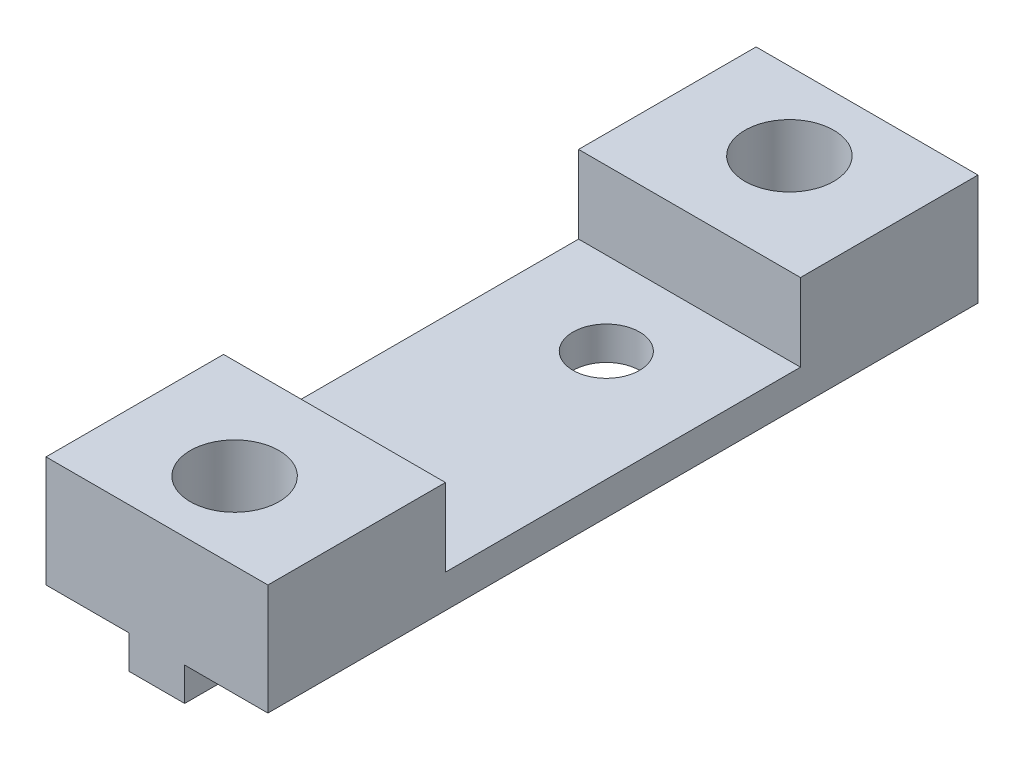
ISO-10303-21;
HEADER;
FILE_DESCRIPTION(('STEP AP214'),'2;1');
FILE_NAME('part.step','',(''),(''),'','','');
FILE_SCHEMA(('AUTOMOTIVE_DESIGN { 1 0 10303 214 1 1 1 1 }'));
ENDSEC;
DATA;
#1=APPLICATION_CONTEXT('core data for automotive mechanical design processes');
#2=APPLICATION_PROTOCOL_DEFINITION('international standard','automotive_design',2000,#1);
#3=PRODUCT_CONTEXT('',#1,'mechanical');
#4=PRODUCT('Part','Part','',(#3));
#5=PRODUCT_RELATED_PRODUCT_CATEGORY('part','',(#4));
#6=PRODUCT_DEFINITION_FORMATION('','',#4);
#7=PRODUCT_DEFINITION_CONTEXT('part definition',#1,'design');
#8=PRODUCT_DEFINITION('design','',#6,#7);
#9=PRODUCT_DEFINITION_SHAPE('','',#8);
#10=(LENGTH_UNIT() NAMED_UNIT(*) SI_UNIT(.MILLI.,.METRE.));
#11=(NAMED_UNIT(*) PLANE_ANGLE_UNIT() SI_UNIT($,.RADIAN.));
#12=(NAMED_UNIT(*) SI_UNIT($,.STERADIAN.) SOLID_ANGLE_UNIT());
#13=UNCERTAINTY_MEASURE_WITH_UNIT(LENGTH_MEASURE(1.E-05),#10,'distance_accuracy_value','');
#14=(GEOMETRIC_REPRESENTATION_CONTEXT(3) GLOBAL_UNCERTAINTY_ASSIGNED_CONTEXT((#13)) GLOBAL_UNIT_ASSIGNED_CONTEXT((#10,
#11,#12)) REPRESENTATION_CONTEXT('',''));
#15=CARTESIAN_POINT('',(0.,0.,0.));
#16=DIRECTION('',(0.,0.,1.));
#17=DIRECTION('',(1.,0.,0.));
#18=AXIS2_PLACEMENT_3D('',#15,#16,#17);
#19=CARTESIAN_POINT('',(0.,0.,0.));
#20=DIRECTION('',(0.,-1.,0.));
#21=DIRECTION('',(0.,0.,-1.));
#22=AXIS2_PLACEMENT_3D('',#19,#20,#21);
#23=PLANE('',#22);
#24=CARTESIAN_POINT('',(0.,0.,8.5));
#25=DIRECTION('',(0.,-1.,0.));
#26=DIRECTION('',(0.,0.,-1.));
#27=AXIS2_PLACEMENT_3D('',#24,#25,#26);
#28=CIRCLE('',#27,3.);
#29=CARTESIAN_POINT('',(0.,0.,5.5));
#30=VERTEX_POINT('',#29);
#31=EDGE_CURVE('E45',#30,#30,#28,.T.);
#32=ORIENTED_EDGE('',*,*,#31,.F.);
#33=EDGE_LOOP('',(#32));
#34=FACE_BOUND('',#33,.T.);
#35=DIRECTION('',(1.,0.,0.));
#36=VECTOR('',#35,1.);
#37=CARTESIAN_POINT('',(-2.5,0.,25.));
#38=LINE('',#37,#36);
#39=CARTESIAN_POINT('',(-2.5,0.,25.));
#40=VERTEX_POINT('',#39);
#41=CARTESIAN_POINT('',(2.5,0.,25.));
#42=VERTEX_POINT('',#41);
#43=EDGE_CURVE('E176',#40,#42,#38,.T.);
#44=ORIENTED_EDGE('',*,*,#43,.F.);
#45=DIRECTION('',(0.,0.,1.));
#46=VECTOR('',#45,1.);
#47=CARTESIAN_POINT('',(-2.5,0.,49.));
#48=LINE('',#47,#46);
#49=CARTESIAN_POINT('',(-2.5,0.,49.));
#50=VERTEX_POINT('',#49);
#51=EDGE_CURVE('E66',#40,#50,#48,.T.);
#52=ORIENTED_EDGE('',*,*,#51,.T.);
#53=DIRECTION('',(-1.,0.,0.));
#54=VECTOR('',#53,1.);
#55=CARTESIAN_POINT('',(-10.,0.,49.));
#56=LINE('',#55,#54);
#57=CARTESIAN_POINT('',(-10.,0.,49.));
#58=VERTEX_POINT('',#57);
#59=EDGE_CURVE('E233',#50,#58,#56,.T.);
#60=ORIENTED_EDGE('',*,*,#59,.T.);
#61=DIRECTION('',(0.,0.,1.));
#62=VECTOR('',#61,1.);
#63=CARTESIAN_POINT('',(-10.,0.,15.));
#64=LINE('',#63,#62);
#65=CARTESIAN_POINT('',(-10.,0.,-15.));
#66=VERTEX_POINT('',#65);
#67=EDGE_CURVE('E327',#66,#58,#64,.T.);
#68=ORIENTED_EDGE('',*,*,#67,.F.);
#69=DIRECTION('',(-1.,0.,0.));
#70=VECTOR('',#69,1.);
#71=CARTESIAN_POINT('',(-10.,0.,-15.));
#72=LINE('',#71,#70);
#73=CARTESIAN_POINT('',(-2.5,0.,-15.));
#74=VERTEX_POINT('',#73);
#75=EDGE_CURVE('E334',#74,#66,#72,.T.);
#76=ORIENTED_EDGE('',*,*,#75,.F.);
#77=DIRECTION('',(0.,0.,-1.));
#78=VECTOR('',#77,1.);
#79=CARTESIAN_POINT('',(-2.5,0.,-15.));
#80=LINE('',#79,#78);
#81=CARTESIAN_POINT('',(-2.5,0.,-3.));
#82=VERTEX_POINT('',#81);
#83=EDGE_CURVE('E287',#82,#74,#80,.T.);
#84=ORIENTED_EDGE('',*,*,#83,.F.);
#85=DIRECTION('',(-1.,0.,0.));
#86=VECTOR('',#85,1.);
#87=CARTESIAN_POINT('',(-2.5,0.,-3.));
#88=LINE('',#87,#86);
#89=CARTESIAN_POINT('',(2.5,0.,-3.));
#90=VERTEX_POINT('',#89);
#91=EDGE_CURVE('E300',#90,#82,#88,.T.);
#92=ORIENTED_EDGE('',*,*,#91,.F.);
#93=DIRECTION('',(0.,0.,1.));
#94=VECTOR('',#93,1.);
#95=CARTESIAN_POINT('',(2.5,0.,-15.));
#96=LINE('',#95,#94);
#97=CARTESIAN_POINT('',(2.5,0.,-15.));
#98=VERTEX_POINT('',#97);
#99=EDGE_CURVE('E281',#98,#90,#96,.T.);
#100=ORIENTED_EDGE('',*,*,#99,.F.);
#101=CARTESIAN_POINT('',(10.,0.,-15.));
#102=VERTEX_POINT('',#101);
#103=EDGE_CURVE('E335',#102,#98,#72,.T.);
#104=ORIENTED_EDGE('',*,*,#103,.F.);
#105=DIRECTION('',(0.,0.,-1.));
#106=VECTOR('',#105,1.);
#107=CARTESIAN_POINT('',(10.,0.,15.));
#108=LINE('',#107,#106);
#109=CARTESIAN_POINT('',(10.,0.,49.));
#110=VERTEX_POINT('',#109);
#111=EDGE_CURVE('E322',#110,#102,#108,.T.);
#112=ORIENTED_EDGE('',*,*,#111,.F.);
#113=CARTESIAN_POINT('',(2.5,0.,49.));
#114=VERTEX_POINT('',#113);
#115=EDGE_CURVE('E234',#110,#114,#56,.T.);
#116=ORIENTED_EDGE('',*,*,#115,.T.);
#117=DIRECTION('',(0.,0.,-1.));
#118=VECTOR('',#117,1.);
#119=CARTESIAN_POINT('',(2.5,0.,49.));
#120=LINE('',#119,#118);
#121=EDGE_CURVE('E58',#114,#42,#120,.T.);
#122=ORIENTED_EDGE('',*,*,#121,.T.);
#123=EDGE_LOOP('',(#44,#52,#60,#68,#76,#84,#92,#100,#104,#112,#116,#122));
#124=FACE_BOUND('',#123,.T.);
#125=ADVANCED_FACE('F41',(#34,#124),#23,.T.);
#126=CARTESIAN_POINT('',(0.,3.,0.));
#127=DIRECTION('',(0.,-1.,0.));
#128=DIRECTION('',(0.,0.,-1.));
#129=AXIS2_PLACEMENT_3D('',#126,#127,#128);
#130=PLANE('',#129);
#131=CARTESIAN_POINT('',(0.,3.,8.5));
#132=DIRECTION('',(0.,-1.,0.));
#133=DIRECTION('',(0.,0.,-1.));
#134=AXIS2_PLACEMENT_3D('',#131,#132,#133);
#135=CIRCLE('',#134,3.);
#136=CARTESIAN_POINT('',(0.,3.,5.5));
#137=VERTEX_POINT('',#136);
#138=EDGE_CURVE('E273',#137,#137,#135,.T.);
#139=ORIENTED_EDGE('',*,*,#138,.T.);
#140=EDGE_LOOP('',(#139));
#141=FACE_BOUND('',#140,.T.);
#142=DIRECTION('',(0.,0.,1.));
#143=VECTOR('',#142,1.);
#144=CARTESIAN_POINT('',(-10.,3.,15.));
#145=LINE('',#144,#143);
#146=CARTESIAN_POINT('',(-10.,3.,0.999999999999997));
#147=VERTEX_POINT('',#146);
#148=CARTESIAN_POINT('',(-10.,3.,33.));
#149=VERTEX_POINT('',#148);
#150=EDGE_CURVE('E326',#147,#149,#145,.T.);
#151=ORIENTED_EDGE('',*,*,#150,.T.);
#152=DIRECTION('',(1.,0.,0.));
#153=VECTOR('',#152,1.);
#154=CARTESIAN_POINT('',(0.,3.,33.));
#155=LINE('',#154,#153);
#156=CARTESIAN_POINT('',(10.,3.,33.));
#157=VERTEX_POINT('',#156);
#158=EDGE_CURVE('E198',#149,#157,#155,.T.);
#159=ORIENTED_EDGE('',*,*,#158,.T.);
#160=DIRECTION('',(0.,0.,-1.));
#161=VECTOR('',#160,1.);
#162=CARTESIAN_POINT('',(10.,3.,15.));
#163=LINE('',#162,#161);
#164=CARTESIAN_POINT('',(10.,3.,0.999999999999997));
#165=VERTEX_POINT('',#164);
#166=EDGE_CURVE('E323',#157,#165,#163,.T.);
#167=ORIENTED_EDGE('',*,*,#166,.T.);
#168=DIRECTION('',(1.,0.,0.));
#169=VECTOR('',#168,1.);
#170=CARTESIAN_POINT('',(0.,3.,0.999999999999997));
#171=LINE('',#170,#169);
#172=EDGE_CURVE('E246',#147,#165,#171,.T.);
#173=ORIENTED_EDGE('',*,*,#172,.F.);
#174=EDGE_LOOP('',(#151,#159,#167,#173));
#175=FACE_BOUND('',#174,.T.);
#176=ADVANCED_FACE('F380',(#141,#175),#130,.F.);
#177=CARTESIAN_POINT('',(10.,3.,15.));
#178=DIRECTION('',(-1.,0.,0.));
#179=DIRECTION('',(0.,0.,1.));
#180=AXIS2_PLACEMENT_3D('',#177,#178,#179);
#181=PLANE('',#180);
#182=DIRECTION('',(0.,-1.,0.));
#183=VECTOR('',#182,1.);
#184=CARTESIAN_POINT('',(10.,35.6124969497314,0.999999999999997));
#185=LINE('',#184,#183);
#186=CARTESIAN_POINT('',(10.,10.,0.999999999999997));
#187=VERTEX_POINT('',#186);
#188=EDGE_CURVE('E245',#187,#165,#185,.T.);
#189=ORIENTED_EDGE('',*,*,#188,.T.);
#190=ORIENTED_EDGE('',*,*,#166,.F.);
#191=DIRECTION('',(0.,-1.,0.));
#192=VECTOR('',#191,1.);
#193=CARTESIAN_POINT('',(10.,35.6124969497314,33.));
#194=LINE('',#193,#192);
#195=CARTESIAN_POINT('',(10.,10.,33.));
#196=VERTEX_POINT('',#195);
#197=EDGE_CURVE('E205',#196,#157,#194,.T.);
#198=ORIENTED_EDGE('',*,*,#197,.F.);
#199=DIRECTION('',(0.,0.,1.));
#200=VECTOR('',#199,1.);
#201=CARTESIAN_POINT('',(10.,10.,34.));
#202=LINE('',#201,#200);
#203=CARTESIAN_POINT('',(10.,10.,49.));
#204=VERTEX_POINT('',#203);
#205=EDGE_CURVE('E194',#196,#204,#202,.T.);
#206=ORIENTED_EDGE('',*,*,#205,.T.);
#207=DIRECTION('',(0.,-1.,0.));
#208=VECTOR('',#207,1.);
#209=CARTESIAN_POINT('',(10.,3.,49.));
#210=LINE('',#209,#208);
#211=EDGE_CURVE('E237',#204,#110,#210,.T.);
#212=ORIENTED_EDGE('',*,*,#211,.T.);
#213=ORIENTED_EDGE('',*,*,#111,.T.);
#214=DIRECTION('',(0.,-1.,0.));
#215=VECTOR('',#214,1.);
#216=CARTESIAN_POINT('',(10.,3.,-15.));
#217=LINE('',#216,#215);
#218=CARTESIAN_POINT('',(10.,10.,-15.));
#219=VERTEX_POINT('',#218);
#220=EDGE_CURVE('E51',#219,#102,#217,.T.);
#221=ORIENTED_EDGE('',*,*,#220,.F.);
#222=DIRECTION('',(0.,0.,-1.));
#223=VECTOR('',#222,1.);
#224=CARTESIAN_POINT('',(10.,10.,0.));
#225=LINE('',#224,#223);
#226=EDGE_CURVE('E260',#187,#219,#225,.T.);
#227=ORIENTED_EDGE('',*,*,#226,.F.);
#228=EDGE_LOOP('',(#189,#190,#198,#206,#212,#213,#221,#227));
#229=FACE_BOUND('',#228,.T.);
#230=ADVANCED_FACE('F43',(#229),#181,.F.);
#231=CARTESIAN_POINT('',(-10.,3.,-15.));
#232=DIRECTION('',(0.,0.,1.));
#233=DIRECTION('',(1.,0.,0.));
#234=AXIS2_PLACEMENT_3D('',#231,#232,#233);
#235=PLANE('',#234);
#236=ORIENTED_EDGE('',*,*,#103,.T.);
#237=DIRECTION('',(0.,1.,0.));
#238=VECTOR('',#237,1.);
#239=CARTESIAN_POINT('',(2.5,-3.,-15.));
#240=LINE('',#239,#238);
#241=CARTESIAN_POINT('',(2.5,-3.,-15.));
#242=VERTEX_POINT('',#241);
#243=EDGE_CURVE('E296',#242,#98,#240,.T.);
#244=ORIENTED_EDGE('',*,*,#243,.F.);
#245=DIRECTION('',(1.,0.,0.));
#246=VECTOR('',#245,1.);
#247=CARTESIAN_POINT('',(-2.5,-3.,-15.));
#248=LINE('',#247,#246);
#249=CARTESIAN_POINT('',(-2.5,-3.,-15.));
#250=VERTEX_POINT('',#249);
#251=EDGE_CURVE('E293',#250,#242,#248,.T.);
#252=ORIENTED_EDGE('',*,*,#251,.F.);
#253=DIRECTION('',(0.,1.,0.));
#254=VECTOR('',#253,1.);
#255=CARTESIAN_POINT('',(-2.5,-3.,-15.));
#256=LINE('',#255,#254);
#257=EDGE_CURVE('E310',#250,#74,#256,.T.);
#258=ORIENTED_EDGE('',*,*,#257,.T.);
#259=ORIENTED_EDGE('',*,*,#75,.T.);
#260=DIRECTION('',(0.,-1.,0.));
#261=VECTOR('',#260,1.);
#262=CARTESIAN_POINT('',(-10.,3.,-15.));
#263=LINE('',#262,#261);
#264=CARTESIAN_POINT('',(-10.,10.,-15.));
#265=VERTEX_POINT('',#264);
#266=EDGE_CURVE('E331',#265,#66,#263,.T.);
#267=ORIENTED_EDGE('',*,*,#266,.F.);
#268=DIRECTION('',(-1.,0.,0.));
#269=VECTOR('',#268,1.);
#270=CARTESIAN_POINT('',(0.,10.,-15.));
#271=LINE('',#270,#269);
#272=EDGE_CURVE('E256',#219,#265,#271,.T.);
#273=ORIENTED_EDGE('',*,*,#272,.F.);
#274=ORIENTED_EDGE('',*,*,#220,.T.);
#275=EDGE_LOOP('',(#236,#244,#252,#258,#259,#267,#273,#274));
#276=FACE_BOUND('',#275,.T.);
#277=ADVANCED_FACE('F349',(#276),#235,.F.);
#278=CARTESIAN_POINT('',(-10.,3.,15.));
#279=DIRECTION('',(1.,0.,0.));
#280=DIRECTION('',(0.,0.,-1.));
#281=AXIS2_PLACEMENT_3D('',#278,#279,#280);
#282=PLANE('',#281);
#283=ORIENTED_EDGE('',*,*,#67,.T.);
#284=DIRECTION('',(0.,-1.,0.));
#285=VECTOR('',#284,1.);
#286=CARTESIAN_POINT('',(-10.,3.,49.));
#287=LINE('',#286,#285);
#288=CARTESIAN_POINT('',(-10.,10.,49.));
#289=VERTEX_POINT('',#288);
#290=EDGE_CURVE('E241',#289,#58,#287,.T.);
#291=ORIENTED_EDGE('',*,*,#290,.F.);
#292=DIRECTION('',(0.,0.,-1.));
#293=VECTOR('',#292,1.);
#294=CARTESIAN_POINT('',(-10.,10.,34.));
#295=LINE('',#294,#293);
#296=CARTESIAN_POINT('',(-10.,10.,33.));
#297=VERTEX_POINT('',#296);
#298=EDGE_CURVE('E183',#289,#297,#295,.T.);
#299=ORIENTED_EDGE('',*,*,#298,.T.);
#300=DIRECTION('',(0.,-1.,0.));
#301=VECTOR('',#300,1.);
#302=CARTESIAN_POINT('',(-10.,35.6124969497314,33.));
#303=LINE('',#302,#301);
#304=EDGE_CURVE('E202',#297,#149,#303,.T.);
#305=ORIENTED_EDGE('',*,*,#304,.T.);
#306=ORIENTED_EDGE('',*,*,#150,.F.);
#307=DIRECTION('',(0.,-1.,0.));
#308=VECTOR('',#307,1.);
#309=CARTESIAN_POINT('',(-10.,35.6124969497314,0.999999999999997));
#310=LINE('',#309,#308);
#311=CARTESIAN_POINT('',(-10.,10.,0.999999999999997));
#312=VERTEX_POINT('',#311);
#313=EDGE_CURVE('E251',#312,#147,#310,.T.);
#314=ORIENTED_EDGE('',*,*,#313,.F.);
#315=DIRECTION('',(0.,0.,1.));
#316=VECTOR('',#315,1.);
#317=CARTESIAN_POINT('',(-10.,10.,0.));
#318=LINE('',#317,#316);
#319=EDGE_CURVE('E252',#265,#312,#318,.T.);
#320=ORIENTED_EDGE('',*,*,#319,.F.);
#321=ORIENTED_EDGE('',*,*,#266,.T.);
#322=EDGE_LOOP('',(#283,#291,#299,#305,#306,#314,#320,#321));
#323=FACE_BOUND('',#322,.T.);
#324=ADVANCED_FACE('F377',(#323),#282,.F.);
#325=CARTESIAN_POINT('',(2.5,-3.,-15.));
#326=DIRECTION('',(-1.,0.,0.));
#327=DIRECTION('',(0.,0.,1.));
#328=AXIS2_PLACEMENT_3D('',#325,#326,#327);
#329=PLANE('',#328);
#330=ORIENTED_EDGE('',*,*,#99,.T.);
#331=DIRECTION('',(0.,1.,0.));
#332=VECTOR('',#331,1.);
#333=CARTESIAN_POINT('',(2.5,-3.,-3.));
#334=LINE('',#333,#332);
#335=CARTESIAN_POINT('',(2.5,-3.,-3.));
#336=VERTEX_POINT('',#335);
#337=EDGE_CURVE('E318',#336,#90,#334,.T.);
#338=ORIENTED_EDGE('',*,*,#337,.F.);
#339=DIRECTION('',(0.,0.,1.));
#340=VECTOR('',#339,1.);
#341=CARTESIAN_POINT('',(2.5,-3.,-15.));
#342=LINE('',#341,#340);
#343=EDGE_CURVE('E282',#242,#336,#342,.T.);
#344=ORIENTED_EDGE('',*,*,#343,.F.);
#345=ORIENTED_EDGE('',*,*,#243,.T.);
#346=EDGE_LOOP('',(#330,#338,#344,#345));
#347=FACE_BOUND('',#346,.T.);
#348=ADVANCED_FACE('F357',(#347),#329,.F.);
#349=CARTESIAN_POINT('',(-2.5,-3.,-3.));
#350=DIRECTION('',(0.,0.,-1.));
#351=DIRECTION('',(-1.,0.,0.));
#352=AXIS2_PLACEMENT_3D('',#349,#350,#351);
#353=PLANE('',#352);
#354=ORIENTED_EDGE('',*,*,#91,.T.);
#355=DIRECTION('',(0.,1.,0.));
#356=VECTOR('',#355,1.);
#357=CARTESIAN_POINT('',(-2.5,-3.,-3.));
#358=LINE('',#357,#356);
#359=CARTESIAN_POINT('',(-2.5,-3.,-3.));
#360=VERTEX_POINT('',#359);
#361=EDGE_CURVE('E314',#360,#82,#358,.T.);
#362=ORIENTED_EDGE('',*,*,#361,.F.);
#363=DIRECTION('',(-1.,0.,0.));
#364=VECTOR('',#363,1.);
#365=CARTESIAN_POINT('',(-2.5,-3.,-3.));
#366=LINE('',#365,#364);
#367=EDGE_CURVE('E286',#336,#360,#366,.T.);
#368=ORIENTED_EDGE('',*,*,#367,.F.);
#369=ORIENTED_EDGE('',*,*,#337,.T.);
#370=EDGE_LOOP('',(#354,#362,#368,#369));
#371=FACE_BOUND('',#370,.T.);
#372=ADVANCED_FACE('F369',(#371),#353,.F.);
#373=CARTESIAN_POINT('',(-2.5,-3.,-15.));
#374=DIRECTION('',(1.,0.,0.));
#375=DIRECTION('',(0.,0.,-1.));
#376=AXIS2_PLACEMENT_3D('',#373,#374,#375);
#377=PLANE('',#376);
#378=ORIENTED_EDGE('',*,*,#83,.T.);
#379=ORIENTED_EDGE('',*,*,#257,.F.);
#380=DIRECTION('',(0.,0.,-1.));
#381=VECTOR('',#380,1.);
#382=CARTESIAN_POINT('',(-2.5,-3.,-15.));
#383=LINE('',#382,#381);
#384=EDGE_CURVE('E290',#360,#250,#383,.T.);
#385=ORIENTED_EDGE('',*,*,#384,.F.);
#386=ORIENTED_EDGE('',*,*,#361,.T.);
#387=EDGE_LOOP('',(#378,#379,#385,#386));
#388=FACE_BOUND('',#387,.T.);
#389=ADVANCED_FACE('F366',(#388),#377,.F.);
#390=CARTESIAN_POINT('',(0.,-3.,0.));
#391=DIRECTION('',(0.,1.,0.));
#392=DIRECTION('',(0.,0.,1.));
#393=AXIS2_PLACEMENT_3D('',#390,#391,#392);
#394=PLANE('',#393);
#395=ORIENTED_EDGE('',*,*,#343,.T.);
#396=ORIENTED_EDGE('',*,*,#367,.T.);
#397=ORIENTED_EDGE('',*,*,#384,.T.);
#398=ORIENTED_EDGE('',*,*,#251,.T.);
#399=EDGE_LOOP('',(#395,#396,#397,#398));
#400=FACE_BOUND('',#399,.T.);
#401=ADVANCED_FACE('F362',(#400),#394,.F.);
#402=CARTESIAN_POINT('',(0.,-3.,8.5));
#403=DIRECTION('',(0.,1.,0.));
#404=DIRECTION('',(0.,0.,1.));
#405=AXIS2_PLACEMENT_3D('',#402,#403,#404);
#406=CYLINDRICAL_SURFACE('',#405,3.);
#407=ORIENTED_EDGE('',*,*,#31,.T.);
#408=EDGE_LOOP('',(#407));
#409=FACE_BOUND('',#408,.T.);
#410=ORIENTED_EDGE('',*,*,#138,.F.);
#411=EDGE_LOOP('',(#410));
#412=FACE_BOUND('',#411,.T.);
#413=ADVANCED_FACE('F571',(#409,#412),#406,.F.);
#414=CARTESIAN_POINT('',(0.,35.6124969497314,0.999999999999997));
#415=DIRECTION('',(0.,0.,-1.));
#416=DIRECTION('',(-1.,0.,0.));
#417=AXIS2_PLACEMENT_3D('',#414,#415,#416);
#418=PLANE('',#417);
#419=DIRECTION('',(1.,0.,0.));
#420=VECTOR('',#419,1.);
#421=CARTESIAN_POINT('',(0.,10.,0.999999999999997));
#422=LINE('',#421,#420);
#423=EDGE_CURVE('E250',#312,#187,#422,.T.);
#424=ORIENTED_EDGE('',*,*,#423,.F.);
#425=ORIENTED_EDGE('',*,*,#313,.T.);
#426=ORIENTED_EDGE('',*,*,#172,.T.);
#427=ORIENTED_EDGE('',*,*,#188,.F.);
#428=EDGE_LOOP('',(#424,#425,#426,#427));
#429=FACE_BOUND('',#428,.T.);
#430=ADVANCED_FACE('F565',(#429),#418,.F.);
#431=CARTESIAN_POINT('',(0.,4.,-8.));
#432=DIRECTION('',(0.,1.,0.));
#433=DIRECTION('',(0.,0.,1.));
#434=AXIS2_PLACEMENT_3D('',#431,#432,#433);
#435=PLANE('',#434);
#436=CARTESIAN_POINT('',(0.,4.,-8.));
#437=DIRECTION('',(0.,1.,0.));
#438=DIRECTION('',(0.,0.,1.));
#439=AXIS2_PLACEMENT_3D('',#436,#437,#438);
#440=CIRCLE('',#439,4.);
#441=CARTESIAN_POINT('',(0.,4.,-4.));
#442=VERTEX_POINT('',#441);
#443=EDGE_CURVE('E11',#442,#442,#440,.T.);
#444=ORIENTED_EDGE('',*,*,#443,.T.);
#445=EDGE_LOOP('',(#444));
#446=FACE_BOUND('',#445,.T.);
#447=ADVANCED_FACE('F570',(#446),#435,.T.);
#448=CARTESIAN_POINT('',(0.,10.,-8.));
#449=DIRECTION('',(0.,-1.,0.));
#450=DIRECTION('',(0.,0.,-1.));
#451=AXIS2_PLACEMENT_3D('',#448,#449,#450);
#452=CYLINDRICAL_SURFACE('',#451,4.);
#453=ORIENTED_EDGE('',*,*,#443,.F.);
#454=EDGE_LOOP('',(#453));
#455=FACE_BOUND('',#454,.T.);
#456=CARTESIAN_POINT('',(0.,10.,-8.));
#457=DIRECTION('',(0.,1.,0.));
#458=DIRECTION('',(0.,0.,1.));
#459=AXIS2_PLACEMENT_3D('',#456,#457,#458);
#460=CIRCLE('',#459,4.);
#461=CARTESIAN_POINT('',(0.,10.,-4.));
#462=VERTEX_POINT('',#461);
#463=EDGE_CURVE('E277',#462,#462,#460,.T.);
#464=ORIENTED_EDGE('',*,*,#463,.T.);
#465=EDGE_LOOP('',(#464));
#466=FACE_BOUND('',#465,.T.);
#467=ADVANCED_FACE('F578',(#455,#466),#452,.F.);
#468=CARTESIAN_POINT('',(0.,10.,-8.));
#469=DIRECTION('',(0.,1.,0.));
#470=DIRECTION('',(0.,0.,1.));
#471=AXIS2_PLACEMENT_3D('',#468,#469,#470);
#472=PLANE('',#471);
#473=ORIENTED_EDGE('',*,*,#272,.T.);
#474=ORIENTED_EDGE('',*,*,#319,.T.);
#475=ORIENTED_EDGE('',*,*,#423,.T.);
#476=ORIENTED_EDGE('',*,*,#226,.T.);
#477=EDGE_LOOP('',(#473,#474,#475,#476));
#478=FACE_BOUND('',#477,.T.);
#479=ORIENTED_EDGE('',*,*,#463,.F.);
#480=EDGE_LOOP('',(#479));
#481=FACE_BOUND('',#480,.T.);
#482=ADVANCED_FACE('F412',(#478,#481),#472,.T.);
#483=CARTESIAN_POINT('',(-10.,3.,49.));
#484=DIRECTION('',(0.,0.,1.));
#485=DIRECTION('',(1.,0.,0.));
#486=AXIS2_PLACEMENT_3D('',#483,#484,#485);
#487=PLANE('',#486);
#488=ORIENTED_EDGE('',*,*,#115,.F.);
#489=ORIENTED_EDGE('',*,*,#211,.F.);
#490=DIRECTION('',(-1.,0.,0.));
#491=VECTOR('',#490,1.);
#492=CARTESIAN_POINT('',(0.,10.,49.));
#493=LINE('',#492,#491);
#494=EDGE_CURVE('E208',#204,#289,#493,.T.);
#495=ORIENTED_EDGE('',*,*,#494,.T.);
#496=ORIENTED_EDGE('',*,*,#290,.T.);
#497=ORIENTED_EDGE('',*,*,#59,.F.);
#498=DIRECTION('',(0.,1.,0.));
#499=VECTOR('',#498,1.);
#500=CARTESIAN_POINT('',(-2.5,-3.,49.));
#501=LINE('',#500,#499);
#502=CARTESIAN_POINT('',(-2.5,-3.,49.));
#503=VERTEX_POINT('',#502);
#504=EDGE_CURVE('E224',#503,#50,#501,.T.);
#505=ORIENTED_EDGE('',*,*,#504,.F.);
#506=DIRECTION('',(1.,0.,0.));
#507=VECTOR('',#506,1.);
#508=CARTESIAN_POINT('',(-2.5,-3.,49.));
#509=LINE('',#508,#507);
#510=CARTESIAN_POINT('',(2.5,-3.,49.));
#511=VERTEX_POINT('',#510);
#512=EDGE_CURVE('E169',#503,#511,#509,.T.);
#513=ORIENTED_EDGE('',*,*,#512,.T.);
#514=DIRECTION('',(0.,1.,0.));
#515=VECTOR('',#514,1.);
#516=CARTESIAN_POINT('',(2.5,-3.,49.));
#517=LINE('',#516,#515);
#518=EDGE_CURVE('E163',#511,#114,#517,.T.);
#519=ORIENTED_EDGE('',*,*,#518,.T.);
#520=EDGE_LOOP('',(#488,#489,#495,#496,#497,#505,#513,#519));
#521=FACE_BOUND('',#520,.T.);
#522=ADVANCED_FACE('F409',(#521),#487,.T.);
#523=CARTESIAN_POINT('',(2.5,-3.,49.));
#524=DIRECTION('',(1.,0.,0.));
#525=DIRECTION('',(0.,0.,-1.));
#526=AXIS2_PLACEMENT_3D('',#523,#524,#525);
#527=PLANE('',#526);
#528=ORIENTED_EDGE('',*,*,#121,.F.);
#529=ORIENTED_EDGE('',*,*,#518,.F.);
#530=DIRECTION('',(0.,0.,-1.));
#531=VECTOR('',#530,1.);
#532=CARTESIAN_POINT('',(2.5,-3.,49.));
#533=LINE('',#532,#531);
#534=CARTESIAN_POINT('',(2.5,-3.,25.));
#535=VERTEX_POINT('',#534);
#536=EDGE_CURVE('E158',#511,#535,#533,.T.);
#537=ORIENTED_EDGE('',*,*,#536,.T.);
#538=DIRECTION('',(0.,-1.,0.));
#539=VECTOR('',#538,1.);
#540=CARTESIAN_POINT('',(2.5,0.,25.));
#541=LINE('',#540,#539);
#542=EDGE_CURVE('E161',#42,#535,#541,.T.);
#543=ORIENTED_EDGE('',*,*,#542,.F.);
#544=EDGE_LOOP('',(#528,#529,#537,#543));
#545=FACE_BOUND('',#544,.T.);
#546=ADVANCED_FACE('F160',(#545),#527,.T.);
#547=CARTESIAN_POINT('',(-2.5,-3.,49.));
#548=DIRECTION('',(-1.,0.,0.));
#549=DIRECTION('',(0.,0.,1.));
#550=AXIS2_PLACEMENT_3D('',#547,#548,#549);
#551=PLANE('',#550);
#552=ORIENTED_EDGE('',*,*,#51,.F.);
#553=DIRECTION('',(0.,1.,0.));
#554=VECTOR('',#553,1.);
#555=CARTESIAN_POINT('',(-2.5,-3.,25.));
#556=LINE('',#555,#554);
#557=CARTESIAN_POINT('',(-2.5,-3.,25.));
#558=VERTEX_POINT('',#557);
#559=EDGE_CURVE('E682',#558,#40,#556,.T.);
#560=ORIENTED_EDGE('',*,*,#559,.F.);
#561=DIRECTION('',(0.,0.,1.));
#562=VECTOR('',#561,1.);
#563=CARTESIAN_POINT('',(-2.5,-3.,49.));
#564=LINE('',#563,#562);
#565=EDGE_CURVE('E181',#558,#503,#564,.T.);
#566=ORIENTED_EDGE('',*,*,#565,.T.);
#567=ORIENTED_EDGE('',*,*,#504,.T.);
#568=EDGE_LOOP('',(#552,#560,#566,#567));
#569=FACE_BOUND('',#568,.T.);
#570=ADVANCED_FACE('F421',(#569),#551,.T.);
#571=CARTESIAN_POINT('',(0.,-3.,34.));
#572=DIRECTION('',(0.,1.,0.));
#573=DIRECTION('',(0.,0.,-1.));
#574=AXIS2_PLACEMENT_3D('',#571,#572,#573);
#575=PLANE('',#574);
#576=ORIENTED_EDGE('',*,*,#536,.F.);
#577=ORIENTED_EDGE('',*,*,#512,.F.);
#578=ORIENTED_EDGE('',*,*,#565,.F.);
#579=DIRECTION('',(-1.,0.,0.));
#580=VECTOR('',#579,1.);
#581=CARTESIAN_POINT('',(2.5,-3.,25.));
#582=LINE('',#581,#580);
#583=EDGE_CURVE('E175',#535,#558,#582,.T.);
#584=ORIENTED_EDGE('',*,*,#583,.F.);
#585=EDGE_LOOP('',(#576,#577,#578,#584));
#586=FACE_BOUND('',#585,.T.);
#587=ADVANCED_FACE('F179',(#586),#575,.F.);
#588=CARTESIAN_POINT('',(0.,35.6124969497314,33.));
#589=DIRECTION('',(0.,0.,-1.));
#590=DIRECTION('',(-1.,0.,0.));
#591=AXIS2_PLACEMENT_3D('',#588,#589,#590);
#592=PLANE('',#591);
#593=ORIENTED_EDGE('',*,*,#304,.F.);
#594=DIRECTION('',(1.,0.,0.));
#595=VECTOR('',#594,1.);
#596=CARTESIAN_POINT('',(0.,10.,33.));
#597=LINE('',#596,#595);
#598=EDGE_CURVE('E187',#297,#196,#597,.T.);
#599=ORIENTED_EDGE('',*,*,#598,.T.);
#600=ORIENTED_EDGE('',*,*,#197,.T.);
#601=ORIENTED_EDGE('',*,*,#158,.F.);
#602=EDGE_LOOP('',(#593,#599,#600,#601));
#603=FACE_BOUND('',#602,.T.);
#604=ADVANCED_FACE('F434',(#603),#592,.T.);
#605=CARTESIAN_POINT('',(0.,4.,42.));
#606=DIRECTION('',(0.,1.,0.));
#607=DIRECTION('',(0.,0.,-1.));
#608=AXIS2_PLACEMENT_3D('',#605,#606,#607);
#609=PLANE('',#608);
#610=CARTESIAN_POINT('',(0.,4.,42.));
#611=DIRECTION('',(0.,-1.,0.));
#612=DIRECTION('',(0.,0.,-1.));
#613=AXIS2_PLACEMENT_3D('',#610,#611,#612);
#614=CIRCLE('',#613,4.);
#615=CARTESIAN_POINT('',(0.,4.,38.));
#616=VERTEX_POINT('',#615);
#617=EDGE_CURVE('E212',#616,#616,#614,.T.);
#618=ORIENTED_EDGE('',*,*,#617,.F.);
#619=EDGE_LOOP('',(#618));
#620=FACE_BOUND('',#619,.T.);
#621=ADVANCED_FACE('F441',(#620),#609,.T.);
#622=CARTESIAN_POINT('',(0.,10.,42.));
#623=DIRECTION('',(0.,-1.,0.));
#624=DIRECTION('',(0.,0.,-1.));
#625=AXIS2_PLACEMENT_3D('',#622,#623,#624);
#626=CYLINDRICAL_SURFACE('',#625,4.);
#627=ORIENTED_EDGE('',*,*,#617,.T.);
#628=EDGE_LOOP('',(#627));
#629=FACE_BOUND('',#628,.T.);
#630=CARTESIAN_POINT('',(0.,10.,42.));
#631=DIRECTION('',(0.,-1.,0.));
#632=DIRECTION('',(0.,0.,-1.));
#633=AXIS2_PLACEMENT_3D('',#630,#631,#632);
#634=CIRCLE('',#633,4.);
#635=CARTESIAN_POINT('',(0.,10.,38.));
#636=VERTEX_POINT('',#635);
#637=EDGE_CURVE('E216',#636,#636,#634,.T.);
#638=ORIENTED_EDGE('',*,*,#637,.F.);
#639=EDGE_LOOP('',(#638));
#640=FACE_BOUND('',#639,.T.);
#641=ADVANCED_FACE('F449',(#629,#640),#626,.F.);
#642=CARTESIAN_POINT('',(0.,10.,42.));
#643=DIRECTION('',(0.,1.,0.));
#644=DIRECTION('',(0.,0.,-1.));
#645=AXIS2_PLACEMENT_3D('',#642,#643,#644);
#646=PLANE('',#645);
#647=ORIENTED_EDGE('',*,*,#637,.T.);
#648=EDGE_LOOP('',(#647));
#649=FACE_BOUND('',#648,.T.);
#650=ORIENTED_EDGE('',*,*,#298,.F.);
#651=ORIENTED_EDGE('',*,*,#494,.F.);
#652=ORIENTED_EDGE('',*,*,#205,.F.);
#653=ORIENTED_EDGE('',*,*,#598,.F.);
#654=EDGE_LOOP('',(#650,#651,#652,#653));
#655=FACE_BOUND('',#654,.T.);
#656=ADVANCED_FACE('F457',(#649,#655),#646,.T.);
#657=CARTESIAN_POINT('',(0.,0.,25.));
#658=DIRECTION('',(0.,0.,-1.));
#659=DIRECTION('',(-1.,0.,0.));
#660=AXIS2_PLACEMENT_3D('',#657,#658,#659);
#661=PLANE('',#660);
#662=ORIENTED_EDGE('',*,*,#559,.T.);
#663=ORIENTED_EDGE('',*,*,#43,.T.);
#664=ORIENTED_EDGE('',*,*,#542,.T.);
#665=ORIENTED_EDGE('',*,*,#583,.T.);
#666=EDGE_LOOP('',(#662,#663,#664,#665));
#667=FACE_BOUND('',#666,.T.);
#668=ADVANCED_FACE('F174',(#667),#661,.T.);
#669=CLOSED_SHELL('',(#125,#176,#230,#277,#324,#348,#372,#389,#401,#413,#430,#447,#467,#482,
#522,#546,#570,#587,#604,#621,#641,#656,#668));
#670=MANIFOLD_SOLID_BREP('B2',#669);
#671=ADVANCED_BREP_SHAPE_REPRESENTATION('',(#18,#670),#14);
#672=SHAPE_DEFINITION_REPRESENTATION(#9,#671);
ENDSEC;
END-ISO-10303-21;
